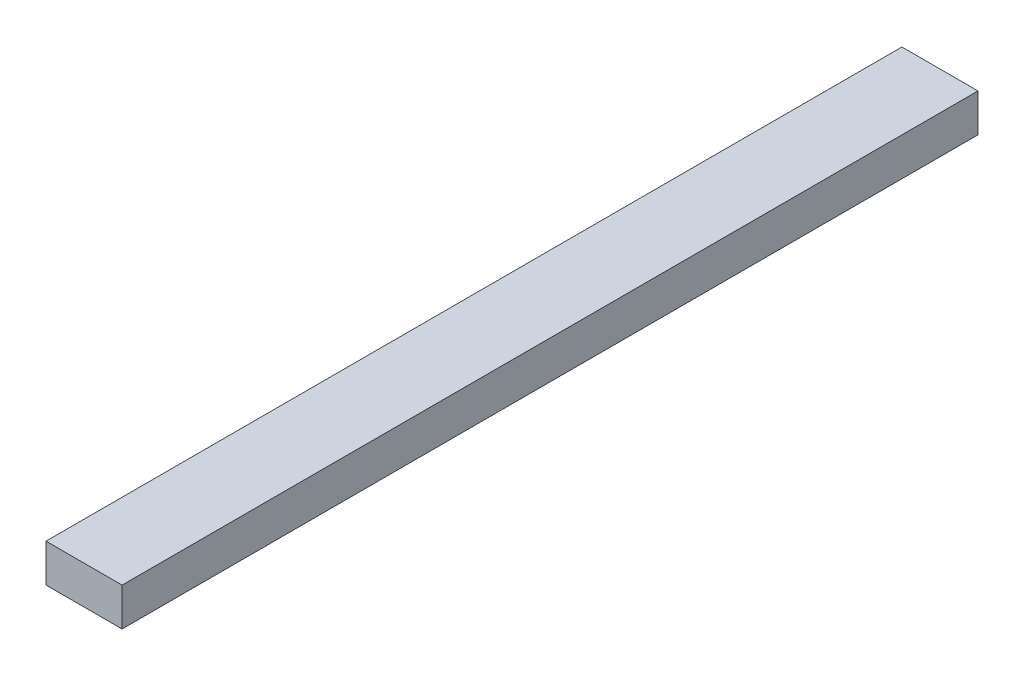
ISO-10303-21;
HEADER;
FILE_DESCRIPTION(('STEP AP214'),'2;1');
FILE_NAME('part.step','',(''),(''),'','','');
FILE_SCHEMA(('AUTOMOTIVE_DESIGN { 1 0 10303 214 1 1 1 1 }'));
ENDSEC;
DATA;
#1=APPLICATION_CONTEXT('core data for automotive mechanical design processes');
#2=APPLICATION_PROTOCOL_DEFINITION('international standard','automotive_design',2000,#1);
#3=PRODUCT_CONTEXT('',#1,'mechanical');
#4=PRODUCT('Part','Part','',(#3));
#5=PRODUCT_RELATED_PRODUCT_CATEGORY('part','',(#4));
#6=PRODUCT_DEFINITION_FORMATION('','',#4);
#7=PRODUCT_DEFINITION_CONTEXT('part definition',#1,'design');
#8=PRODUCT_DEFINITION('design','',#6,#7);
#9=PRODUCT_DEFINITION_SHAPE('','',#8);
#10=(LENGTH_UNIT() NAMED_UNIT(*) SI_UNIT(.MILLI.,.METRE.));
#11=(NAMED_UNIT(*) PLANE_ANGLE_UNIT() SI_UNIT($,.RADIAN.));
#12=(NAMED_UNIT(*) SI_UNIT($,.STERADIAN.) SOLID_ANGLE_UNIT());
#13=UNCERTAINTY_MEASURE_WITH_UNIT(LENGTH_MEASURE(1.E-05),#10,'distance_accuracy_value','');
#14=(GEOMETRIC_REPRESENTATION_CONTEXT(3) GLOBAL_UNCERTAINTY_ASSIGNED_CONTEXT((#13)) GLOBAL_UNIT_ASSIGNED_CONTEXT((#10,
#11,#12)) REPRESENTATION_CONTEXT('',''));
#15=CARTESIAN_POINT('',(0.,0.,0.));
#16=DIRECTION('',(0.,0.,1.));
#17=DIRECTION('',(1.,0.,0.));
#18=AXIS2_PLACEMENT_3D('',#15,#16,#17);
#19=CARTESIAN_POINT('',(20.,-10.,450.));
#20=DIRECTION('',(-1.,0.,0.));
#21=DIRECTION('',(0.,0.,1.));
#22=AXIS2_PLACEMENT_3D('',#19,#20,#21);
#23=PLANE('',#22);
#24=DIRECTION('',(0.,1.,0.));
#25=VECTOR('',#24,1.);
#26=CARTESIAN_POINT('',(20.,-10.,0.));
#27=LINE('',#26,#25);
#28=CARTESIAN_POINT('',(20.,-10.,0.));
#29=VERTEX_POINT('',#28);
#30=CARTESIAN_POINT('',(20.,10.,0.));
#31=VERTEX_POINT('',#30);
#32=EDGE_CURVE('E98',#29,#31,#27,.T.);
#33=ORIENTED_EDGE('',*,*,#32,.T.);
#34=DIRECTION('',(0.,0.,-1.));
#35=VECTOR('',#34,1.);
#36=CARTESIAN_POINT('',(20.,10.,450.));
#37=LINE('',#36,#35);
#38=CARTESIAN_POINT('',(20.,10.,450.));
#39=VERTEX_POINT('',#38);
#40=EDGE_CURVE('E11',#39,#31,#37,.T.);
#41=ORIENTED_EDGE('',*,*,#40,.F.);
#42=DIRECTION('',(0.,1.,0.));
#43=VECTOR('',#42,1.);
#44=CARTESIAN_POINT('',(20.,-10.,450.));
#45=LINE('',#44,#43);
#46=CARTESIAN_POINT('',(20.,-10.,450.));
#47=VERTEX_POINT('',#46);
#48=EDGE_CURVE('E86',#47,#39,#45,.T.);
#49=ORIENTED_EDGE('',*,*,#48,.F.);
#50=DIRECTION('',(0.,0.,-1.));
#51=VECTOR('',#50,1.);
#52=CARTESIAN_POINT('',(20.,-10.,450.));
#53=LINE('',#52,#51);
#54=EDGE_CURVE('E94',#47,#29,#53,.T.);
#55=ORIENTED_EDGE('',*,*,#54,.T.);
#56=EDGE_LOOP('',(#33,#41,#49,#55));
#57=FACE_BOUND('',#56,.T.);
#58=ADVANCED_FACE('F35',(#57),#23,.F.);
#59=CARTESIAN_POINT('',(-20.,10.,450.));
#60=DIRECTION('',(0.,-1.,0.));
#61=DIRECTION('',(0.,0.,-1.));
#62=AXIS2_PLACEMENT_3D('',#59,#60,#61);
#63=PLANE('',#62);
#64=DIRECTION('',(-1.,0.,0.));
#65=VECTOR('',#64,1.);
#66=CARTESIAN_POINT('',(-20.,10.,0.));
#67=LINE('',#66,#65);
#68=CARTESIAN_POINT('',(-20.,10.,0.));
#69=VERTEX_POINT('',#68);
#70=EDGE_CURVE('E90',#31,#69,#67,.T.);
#71=ORIENTED_EDGE('',*,*,#70,.T.);
#72=DIRECTION('',(0.,0.,-1.));
#73=VECTOR('',#72,1.);
#74=CARTESIAN_POINT('',(-20.,10.,450.));
#75=LINE('',#74,#73);
#76=CARTESIAN_POINT('',(-20.,10.,450.));
#77=VERTEX_POINT('',#76);
#78=EDGE_CURVE('E43',#77,#69,#75,.T.);
#79=ORIENTED_EDGE('',*,*,#78,.F.);
#80=DIRECTION('',(-1.,0.,0.));
#81=VECTOR('',#80,1.);
#82=CARTESIAN_POINT('',(-20.,10.,450.));
#83=LINE('',#82,#81);
#84=EDGE_CURVE('E81',#39,#77,#83,.T.);
#85=ORIENTED_EDGE('',*,*,#84,.F.);
#86=ORIENTED_EDGE('',*,*,#40,.T.);
#87=EDGE_LOOP('',(#71,#79,#85,#86));
#88=FACE_BOUND('',#87,.T.);
#89=ADVANCED_FACE('F89',(#88),#63,.F.);
#90=CARTESIAN_POINT('',(-20.,-10.,450.));
#91=DIRECTION('',(1.,0.,0.));
#92=DIRECTION('',(0.,0.,-1.));
#93=AXIS2_PLACEMENT_3D('',#90,#91,#92);
#94=PLANE('',#93);
#95=DIRECTION('',(0.,-1.,0.));
#96=VECTOR('',#95,1.);
#97=CARTESIAN_POINT('',(-20.,-10.,0.));
#98=LINE('',#97,#96);
#99=CARTESIAN_POINT('',(-20.,-10.,0.));
#100=VERTEX_POINT('',#99);
#101=EDGE_CURVE('E68',#69,#100,#98,.T.);
#102=ORIENTED_EDGE('',*,*,#101,.T.);
#103=DIRECTION('',(0.,0.,-1.));
#104=VECTOR('',#103,1.);
#105=CARTESIAN_POINT('',(-20.,-10.,450.));
#106=LINE('',#105,#104);
#107=CARTESIAN_POINT('',(-20.,-10.,450.));
#108=VERTEX_POINT('',#107);
#109=EDGE_CURVE('E91',#108,#100,#106,.T.);
#110=ORIENTED_EDGE('',*,*,#109,.F.);
#111=DIRECTION('',(0.,-1.,0.));
#112=VECTOR('',#111,1.);
#113=CARTESIAN_POINT('',(-20.,-10.,450.));
#114=LINE('',#113,#112);
#115=EDGE_CURVE('E84',#77,#108,#114,.T.);
#116=ORIENTED_EDGE('',*,*,#115,.F.);
#117=ORIENTED_EDGE('',*,*,#78,.T.);
#118=EDGE_LOOP('',(#102,#110,#116,#117));
#119=FACE_BOUND('',#118,.T.);
#120=ADVANCED_FACE('F92',(#119),#94,.F.);
#121=CARTESIAN_POINT('',(-20.,-10.,450.));
#122=DIRECTION('',(0.,1.,0.));
#123=DIRECTION('',(0.,0.,1.));
#124=AXIS2_PLACEMENT_3D('',#121,#122,#123);
#125=PLANE('',#124);
#126=DIRECTION('',(1.,0.,0.));
#127=VECTOR('',#126,1.);
#128=CARTESIAN_POINT('',(-20.,-10.,0.));
#129=LINE('',#128,#127);
#130=EDGE_CURVE('E74',#100,#29,#129,.T.);
#131=ORIENTED_EDGE('',*,*,#130,.T.);
#132=ORIENTED_EDGE('',*,*,#54,.F.);
#133=DIRECTION('',(1.,0.,0.));
#134=VECTOR('',#133,1.);
#135=CARTESIAN_POINT('',(-20.,-10.,450.));
#136=LINE('',#135,#134);
#137=EDGE_CURVE('E51',#108,#47,#136,.T.);
#138=ORIENTED_EDGE('',*,*,#137,.F.);
#139=ORIENTED_EDGE('',*,*,#109,.T.);
#140=EDGE_LOOP('',(#131,#132,#138,#139));
#141=FACE_BOUND('',#140,.T.);
#142=ADVANCED_FACE('F105',(#141),#125,.F.);
#143=CARTESIAN_POINT('',(0.,0.,450.));
#144=DIRECTION('',(0.,0.,-1.));
#145=DIRECTION('',(-1.,0.,0.));
#146=AXIS2_PLACEMENT_3D('',#143,#144,#145);
#147=PLANE('',#146);
#148=ORIENTED_EDGE('',*,*,#48,.T.);
#149=ORIENTED_EDGE('',*,*,#84,.T.);
#150=ORIENTED_EDGE('',*,*,#115,.T.);
#151=ORIENTED_EDGE('',*,*,#137,.T.);
#152=EDGE_LOOP('',(#148,#149,#150,#151));
#153=FACE_BOUND('',#152,.T.);
#154=ADVANCED_FACE('F82',(#153),#147,.F.);
#155=CARTESIAN_POINT('',(0.,0.,0.));
#156=DIRECTION('',(0.,0.,-1.));
#157=DIRECTION('',(-1.,0.,0.));
#158=AXIS2_PLACEMENT_3D('',#155,#156,#157);
#159=PLANE('',#158);
#160=ORIENTED_EDGE('',*,*,#32,.F.);
#161=ORIENTED_EDGE('',*,*,#130,.F.);
#162=ORIENTED_EDGE('',*,*,#101,.F.);
#163=ORIENTED_EDGE('',*,*,#70,.F.);
#164=EDGE_LOOP('',(#160,#161,#162,#163));
#165=FACE_BOUND('',#164,.T.);
#166=ADVANCED_FACE('F108',(#165),#159,.T.);
#167=CLOSED_SHELL('',(#58,#89,#120,#142,#154,#166));
#168=MANIFOLD_SOLID_BREP('B2',#167);
#169=ADVANCED_BREP_SHAPE_REPRESENTATION('',(#18,#168),#14);
#170=SHAPE_DEFINITION_REPRESENTATION(#9,#169);
ENDSEC;
END-ISO-10303-21;
